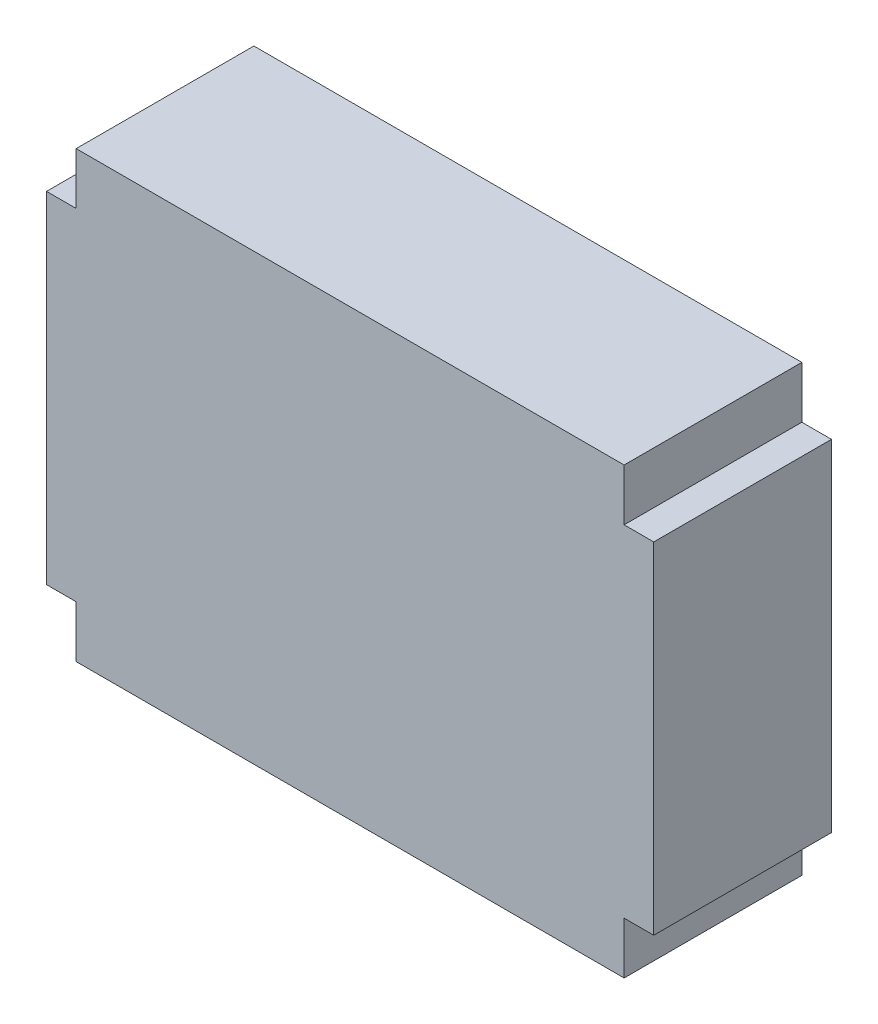
ISO-10303-21;
HEADER;
FILE_DESCRIPTION(('STEP AP214'),'2;1');
FILE_NAME('part.step','',(''),(''),'','','');
FILE_SCHEMA(('AUTOMOTIVE_DESIGN { 1 0 10303 214 1 1 1 1 }'));
ENDSEC;
DATA;
#1=APPLICATION_CONTEXT('core data for automotive mechanical design processes');
#2=APPLICATION_PROTOCOL_DEFINITION('international standard','automotive_design',2000,#1);
#3=PRODUCT_CONTEXT('',#1,'mechanical');
#4=PRODUCT('Part','Part','',(#3));
#5=PRODUCT_RELATED_PRODUCT_CATEGORY('part','',(#4));
#6=PRODUCT_DEFINITION_FORMATION('','',#4);
#7=PRODUCT_DEFINITION_CONTEXT('part definition',#1,'design');
#8=PRODUCT_DEFINITION('design','',#6,#7);
#9=PRODUCT_DEFINITION_SHAPE('','',#8);
#10=(LENGTH_UNIT() NAMED_UNIT(*) SI_UNIT(.MILLI.,.METRE.));
#11=(NAMED_UNIT(*) PLANE_ANGLE_UNIT() SI_UNIT($,.RADIAN.));
#12=(NAMED_UNIT(*) SI_UNIT($,.STERADIAN.) SOLID_ANGLE_UNIT());
#13=UNCERTAINTY_MEASURE_WITH_UNIT(LENGTH_MEASURE(1.E-05),#10,'distance_accuracy_value','');
#14=(GEOMETRIC_REPRESENTATION_CONTEXT(3) GLOBAL_UNCERTAINTY_ASSIGNED_CONTEXT((#13)) GLOBAL_UNIT_ASSIGNED_CONTEXT((#10,
#11,#12)) REPRESENTATION_CONTEXT('',''));
#15=CARTESIAN_POINT('',(0.,0.,0.));
#16=DIRECTION('',(0.,0.,1.));
#17=DIRECTION('',(1.,0.,0.));
#18=AXIS2_PLACEMENT_3D('',#15,#16,#17);
#19=CARTESIAN_POINT('',(-1.85,-1.5,1.2));
#20=DIRECTION('',(0.,1.,0.));
#21=DIRECTION('',(0.,0.,1.));
#22=AXIS2_PLACEMENT_3D('',#19,#20,#21);
#23=PLANE('',#22);
#24=DIRECTION('',(1.,0.,0.));
#25=VECTOR('',#24,1.);
#26=CARTESIAN_POINT('',(-1.85,-1.5,0.));
#27=LINE('',#26,#25);
#28=CARTESIAN_POINT('',(-1.85,-1.5,0.));
#29=VERTEX_POINT('',#28);
#30=CARTESIAN_POINT('',(1.85,-1.5,0.));
#31=VERTEX_POINT('',#30);
#32=EDGE_CURVE('E154',#29,#31,#27,.T.);
#33=ORIENTED_EDGE('',*,*,#32,.T.);
#34=DIRECTION('',(0.,0.,-1.));
#35=VECTOR('',#34,1.);
#36=CARTESIAN_POINT('',(1.85,-1.5,1.2));
#37=LINE('',#36,#35);
#38=CARTESIAN_POINT('',(1.85,-1.5,1.2));
#39=VERTEX_POINT('',#38);
#40=EDGE_CURVE('E11',#39,#31,#37,.T.);
#41=ORIENTED_EDGE('',*,*,#40,.F.);
#42=DIRECTION('',(1.,0.,0.));
#43=VECTOR('',#42,1.);
#44=CARTESIAN_POINT('',(-1.85,-1.5,1.2));
#45=LINE('',#44,#43);
#46=CARTESIAN_POINT('',(-1.85,-1.5,1.2));
#47=VERTEX_POINT('',#46);
#48=EDGE_CURVE('E176',#47,#39,#45,.T.);
#49=ORIENTED_EDGE('',*,*,#48,.F.);
#50=DIRECTION('',(0.,0.,-1.));
#51=VECTOR('',#50,1.);
#52=CARTESIAN_POINT('',(-1.85,-1.5,1.2));
#53=LINE('',#52,#51);
#54=EDGE_CURVE('E150',#47,#29,#53,.T.);
#55=ORIENTED_EDGE('',*,*,#54,.T.);
#56=EDGE_LOOP('',(#33,#41,#49,#55));
#57=FACE_BOUND('',#56,.T.);
#58=ADVANCED_FACE('F34',(#57),#23,.F.);
#59=CARTESIAN_POINT('',(1.85,-1.5,1.2));
#60=DIRECTION('',(-1.,0.,0.));
#61=DIRECTION('',(0.,0.,1.));
#62=AXIS2_PLACEMENT_3D('',#59,#60,#61);
#63=PLANE('',#62);
#64=DIRECTION('',(0.,1.,0.));
#65=VECTOR('',#64,1.);
#66=CARTESIAN_POINT('',(1.85,-1.5,0.));
#67=LINE('',#66,#65);
#68=CARTESIAN_POINT('',(1.85,-1.15,0.));
#69=VERTEX_POINT('',#68);
#70=EDGE_CURVE('E157',#31,#69,#67,.T.);
#71=ORIENTED_EDGE('',*,*,#70,.T.);
#72=DIRECTION('',(0.,0.,-1.));
#73=VECTOR('',#72,1.);
#74=CARTESIAN_POINT('',(1.85,-1.15,1.2));
#75=LINE('',#74,#73);
#76=CARTESIAN_POINT('',(1.85,-1.15,1.2));
#77=VERTEX_POINT('',#76);
#78=EDGE_CURVE('E42',#77,#69,#75,.T.);
#79=ORIENTED_EDGE('',*,*,#78,.F.);
#80=DIRECTION('',(0.,1.,0.));
#81=VECTOR('',#80,1.);
#82=CARTESIAN_POINT('',(1.85,-1.5,1.2));
#83=LINE('',#82,#81);
#84=EDGE_CURVE('E105',#39,#77,#83,.T.);
#85=ORIENTED_EDGE('',*,*,#84,.F.);
#86=ORIENTED_EDGE('',*,*,#40,.T.);
#87=EDGE_LOOP('',(#71,#79,#85,#86));
#88=FACE_BOUND('',#87,.T.);
#89=ADVANCED_FACE('F254',(#88),#63,.F.);
#90=CARTESIAN_POINT('',(1.85,-1.15,1.2));
#91=DIRECTION('',(0.,1.,0.));
#92=DIRECTION('',(0.,0.,1.));
#93=AXIS2_PLACEMENT_3D('',#90,#91,#92);
#94=PLANE('',#93);
#95=DIRECTION('',(1.,0.,0.));
#96=VECTOR('',#95,1.);
#97=CARTESIAN_POINT('',(1.85,-1.15,0.));
#98=LINE('',#97,#96);
#99=CARTESIAN_POINT('',(2.05,-1.15,0.));
#100=VERTEX_POINT('',#99);
#101=EDGE_CURVE('E159',#69,#100,#98,.T.);
#102=ORIENTED_EDGE('',*,*,#101,.T.);
#103=DIRECTION('',(0.,0.,-1.));
#104=VECTOR('',#103,1.);
#105=CARTESIAN_POINT('',(2.05,-1.15,1.2));
#106=LINE('',#105,#104);
#107=CARTESIAN_POINT('',(2.05,-1.15,1.2));
#108=VERTEX_POINT('',#107);
#109=EDGE_CURVE('E195',#108,#100,#106,.T.);
#110=ORIENTED_EDGE('',*,*,#109,.F.);
#111=DIRECTION('',(1.,0.,0.));
#112=VECTOR('',#111,1.);
#113=CARTESIAN_POINT('',(1.85,-1.15,1.2));
#114=LINE('',#113,#112);
#115=EDGE_CURVE('E203',#77,#108,#114,.T.);
#116=ORIENTED_EDGE('',*,*,#115,.F.);
#117=ORIENTED_EDGE('',*,*,#78,.T.);
#118=EDGE_LOOP('',(#102,#110,#116,#117));
#119=FACE_BOUND('',#118,.T.);
#120=ADVANCED_FACE('F201',(#119),#94,.F.);
#121=CARTESIAN_POINT('',(2.05,-1.15,1.2));
#122=DIRECTION('',(-1.,0.,0.));
#123=DIRECTION('',(0.,0.,1.));
#124=AXIS2_PLACEMENT_3D('',#121,#122,#123);
#125=PLANE('',#124);
#126=DIRECTION('',(0.,1.,0.));
#127=VECTOR('',#126,1.);
#128=CARTESIAN_POINT('',(2.05,-1.15,0.));
#129=LINE('',#128,#127);
#130=CARTESIAN_POINT('',(2.05,1.15,0.));
#131=VERTEX_POINT('',#130);
#132=EDGE_CURVE('E161',#100,#131,#129,.T.);
#133=ORIENTED_EDGE('',*,*,#132,.T.);
#134=DIRECTION('',(0.,0.,-1.));
#135=VECTOR('',#134,1.);
#136=CARTESIAN_POINT('',(2.05,1.15,1.2));
#137=LINE('',#136,#135);
#138=CARTESIAN_POINT('',(2.05,1.15,1.2));
#139=VERTEX_POINT('',#138);
#140=EDGE_CURVE('E192',#139,#131,#137,.T.);
#141=ORIENTED_EDGE('',*,*,#140,.F.);
#142=DIRECTION('',(0.,1.,0.));
#143=VECTOR('',#142,1.);
#144=CARTESIAN_POINT('',(2.05,-1.15,1.2));
#145=LINE('',#144,#143);
#146=EDGE_CURVE('E221',#108,#139,#145,.T.);
#147=ORIENTED_EDGE('',*,*,#146,.F.);
#148=ORIENTED_EDGE('',*,*,#109,.T.);
#149=EDGE_LOOP('',(#133,#141,#147,#148));
#150=FACE_BOUND('',#149,.T.);
#151=ADVANCED_FACE('F212',(#150),#125,.F.);
#152=CARTESIAN_POINT('',(2.05,1.15,1.2));
#153=DIRECTION('',(0.,-1.,0.));
#154=DIRECTION('',(0.,0.,-1.));
#155=AXIS2_PLACEMENT_3D('',#152,#153,#154);
#156=PLANE('',#155);
#157=DIRECTION('',(-1.,0.,0.));
#158=VECTOR('',#157,1.);
#159=CARTESIAN_POINT('',(2.05,1.15,0.));
#160=LINE('',#159,#158);
#161=CARTESIAN_POINT('',(1.85,1.15,0.));
#162=VERTEX_POINT('',#161);
#163=EDGE_CURVE('E163',#131,#162,#160,.T.);
#164=ORIENTED_EDGE('',*,*,#163,.T.);
#165=DIRECTION('',(0.,0.,-1.));
#166=VECTOR('',#165,1.);
#167=CARTESIAN_POINT('',(1.85,1.15,1.2));
#168=LINE('',#167,#166);
#169=CARTESIAN_POINT('',(1.85,1.15,1.2));
#170=VERTEX_POINT('',#169);
#171=EDGE_CURVE('E189',#170,#162,#168,.T.);
#172=ORIENTED_EDGE('',*,*,#171,.F.);
#173=DIRECTION('',(-1.,0.,0.));
#174=VECTOR('',#173,1.);
#175=CARTESIAN_POINT('',(2.05,1.15,1.2));
#176=LINE('',#175,#174);
#177=EDGE_CURVE('E218',#139,#170,#176,.T.);
#178=ORIENTED_EDGE('',*,*,#177,.F.);
#179=ORIENTED_EDGE('',*,*,#140,.T.);
#180=EDGE_LOOP('',(#164,#172,#178,#179));
#181=FACE_BOUND('',#180,.T.);
#182=ADVANCED_FACE('F216',(#181),#156,.F.);
#183=CARTESIAN_POINT('',(1.85,1.15,1.2));
#184=DIRECTION('',(-1.,0.,0.));
#185=DIRECTION('',(0.,0.,1.));
#186=AXIS2_PLACEMENT_3D('',#183,#184,#185);
#187=PLANE('',#186);
#188=DIRECTION('',(0.,1.,0.));
#189=VECTOR('',#188,1.);
#190=CARTESIAN_POINT('',(1.85,1.15,0.));
#191=LINE('',#190,#189);
#192=CARTESIAN_POINT('',(1.85,1.5,0.));
#193=VERTEX_POINT('',#192);
#194=EDGE_CURVE('E165',#162,#193,#191,.T.);
#195=ORIENTED_EDGE('',*,*,#194,.T.);
#196=DIRECTION('',(0.,0.,-1.));
#197=VECTOR('',#196,1.);
#198=CARTESIAN_POINT('',(1.85,1.5,1.2));
#199=LINE('',#198,#197);
#200=CARTESIAN_POINT('',(1.85,1.5,1.2));
#201=VERTEX_POINT('',#200);
#202=EDGE_CURVE('E186',#201,#193,#199,.T.);
#203=ORIENTED_EDGE('',*,*,#202,.F.);
#204=DIRECTION('',(0.,1.,0.));
#205=VECTOR('',#204,1.);
#206=CARTESIAN_POINT('',(1.85,1.15,1.2));
#207=LINE('',#206,#205);
#208=EDGE_CURVE('E220',#170,#201,#207,.T.);
#209=ORIENTED_EDGE('',*,*,#208,.F.);
#210=ORIENTED_EDGE('',*,*,#171,.T.);
#211=EDGE_LOOP('',(#195,#203,#209,#210));
#212=FACE_BOUND('',#211,.T.);
#213=ADVANCED_FACE('F267',(#212),#187,.F.);
#214=CARTESIAN_POINT('',(1.85,1.5,1.2));
#215=DIRECTION('',(0.,-1.,0.));
#216=DIRECTION('',(0.,0.,-1.));
#217=AXIS2_PLACEMENT_3D('',#214,#215,#216);
#218=PLANE('',#217);
#219=DIRECTION('',(-1.,0.,0.));
#220=VECTOR('',#219,1.);
#221=CARTESIAN_POINT('',(1.85,1.5,0.));
#222=LINE('',#221,#220);
#223=CARTESIAN_POINT('',(-1.85,1.5,0.));
#224=VERTEX_POINT('',#223);
#225=EDGE_CURVE('E167',#193,#224,#222,.T.);
#226=ORIENTED_EDGE('',*,*,#225,.T.);
#227=DIRECTION('',(0.,0.,-1.));
#228=VECTOR('',#227,1.);
#229=CARTESIAN_POINT('',(-1.85,1.5,1.2));
#230=LINE('',#229,#228);
#231=CARTESIAN_POINT('',(-1.85,1.5,1.2));
#232=VERTEX_POINT('',#231);
#233=EDGE_CURVE('E183',#232,#224,#230,.T.);
#234=ORIENTED_EDGE('',*,*,#233,.F.);
#235=DIRECTION('',(-1.,0.,0.));
#236=VECTOR('',#235,1.);
#237=CARTESIAN_POINT('',(1.85,1.5,1.2));
#238=LINE('',#237,#236);
#239=EDGE_CURVE('E223',#201,#232,#238,.T.);
#240=ORIENTED_EDGE('',*,*,#239,.F.);
#241=ORIENTED_EDGE('',*,*,#202,.T.);
#242=EDGE_LOOP('',(#226,#234,#240,#241));
#243=FACE_BOUND('',#242,.T.);
#244=ADVANCED_FACE('F270',(#243),#218,.F.);
#245=CARTESIAN_POINT('',(-1.85,1.5,1.2));
#246=DIRECTION('',(1.,0.,0.));
#247=DIRECTION('',(0.,0.,-1.));
#248=AXIS2_PLACEMENT_3D('',#245,#246,#247);
#249=PLANE('',#248);
#250=DIRECTION('',(0.,-1.,0.));
#251=VECTOR('',#250,1.);
#252=CARTESIAN_POINT('',(-1.85,1.5,0.));
#253=LINE('',#252,#251);
#254=CARTESIAN_POINT('',(-1.85,1.15,0.));
#255=VERTEX_POINT('',#254);
#256=EDGE_CURVE('E169',#224,#255,#253,.T.);
#257=ORIENTED_EDGE('',*,*,#256,.T.);
#258=DIRECTION('',(0.,0.,-1.));
#259=VECTOR('',#258,1.);
#260=CARTESIAN_POINT('',(-1.85,1.15,1.2));
#261=LINE('',#260,#259);
#262=CARTESIAN_POINT('',(-1.85,1.15,1.2));
#263=VERTEX_POINT('',#262);
#264=EDGE_CURVE('E180',#263,#255,#261,.T.);
#265=ORIENTED_EDGE('',*,*,#264,.F.);
#266=DIRECTION('',(0.,-1.,0.));
#267=VECTOR('',#266,1.);
#268=CARTESIAN_POINT('',(-1.85,1.5,1.2));
#269=LINE('',#268,#267);
#270=EDGE_CURVE('E229',#232,#263,#269,.T.);
#271=ORIENTED_EDGE('',*,*,#270,.F.);
#272=ORIENTED_EDGE('',*,*,#233,.T.);
#273=EDGE_LOOP('',(#257,#265,#271,#272));
#274=FACE_BOUND('',#273,.T.);
#275=ADVANCED_FACE('F235',(#274),#249,.F.);
#276=CARTESIAN_POINT('',(-1.85,1.15,1.2));
#277=DIRECTION('',(0.,-1.,0.));
#278=DIRECTION('',(0.,0.,-1.));
#279=AXIS2_PLACEMENT_3D('',#276,#277,#278);
#280=PLANE('',#279);
#281=DIRECTION('',(-1.,0.,0.));
#282=VECTOR('',#281,1.);
#283=CARTESIAN_POINT('',(-1.85,1.15,0.));
#284=LINE('',#283,#282);
#285=CARTESIAN_POINT('',(-2.05,1.15,0.));
#286=VERTEX_POINT('',#285);
#287=EDGE_CURVE('E171',#255,#286,#284,.T.);
#288=ORIENTED_EDGE('',*,*,#287,.T.);
#289=DIRECTION('',(0.,0.,-1.));
#290=VECTOR('',#289,1.);
#291=CARTESIAN_POINT('',(-2.05,1.15,1.2));
#292=LINE('',#291,#290);
#293=CARTESIAN_POINT('',(-2.05,1.15,1.2));
#294=VERTEX_POINT('',#293);
#295=EDGE_CURVE('E145',#294,#286,#292,.T.);
#296=ORIENTED_EDGE('',*,*,#295,.F.);
#297=DIRECTION('',(-1.,0.,0.));
#298=VECTOR('',#297,1.);
#299=CARTESIAN_POINT('',(-1.85,1.15,1.2));
#300=LINE('',#299,#298);
#301=EDGE_CURVE('E136',#263,#294,#300,.T.);
#302=ORIENTED_EDGE('',*,*,#301,.F.);
#303=ORIENTED_EDGE('',*,*,#264,.T.);
#304=EDGE_LOOP('',(#288,#296,#302,#303));
#305=FACE_BOUND('',#304,.T.);
#306=ADVANCED_FACE('F239',(#305),#280,.F.);
#307=CARTESIAN_POINT('',(-2.05,1.15,1.2));
#308=DIRECTION('',(1.,0.,0.));
#309=DIRECTION('',(0.,0.,-1.));
#310=AXIS2_PLACEMENT_3D('',#307,#308,#309);
#311=PLANE('',#310);
#312=DIRECTION('',(0.,-1.,0.));
#313=VECTOR('',#312,1.);
#314=CARTESIAN_POINT('',(-2.05,1.15,0.));
#315=LINE('',#314,#313);
#316=CARTESIAN_POINT('',(-2.05,-1.15,0.));
#317=VERTEX_POINT('',#316);
#318=EDGE_CURVE('E144',#286,#317,#315,.T.);
#319=ORIENTED_EDGE('',*,*,#318,.T.);
#320=DIRECTION('',(0.,0.,-1.));
#321=VECTOR('',#320,1.);
#322=CARTESIAN_POINT('',(-2.05,-1.15,1.2));
#323=LINE('',#322,#321);
#324=CARTESIAN_POINT('',(-2.05,-1.15,1.2));
#325=VERTEX_POINT('',#324);
#326=EDGE_CURVE('E141',#325,#317,#323,.T.);
#327=ORIENTED_EDGE('',*,*,#326,.F.);
#328=DIRECTION('',(0.,-1.,0.));
#329=VECTOR('',#328,1.);
#330=CARTESIAN_POINT('',(-2.05,1.15,1.2));
#331=LINE('',#330,#329);
#332=EDGE_CURVE('E130',#294,#325,#331,.T.);
#333=ORIENTED_EDGE('',*,*,#332,.F.);
#334=ORIENTED_EDGE('',*,*,#295,.T.);
#335=EDGE_LOOP('',(#319,#327,#333,#334));
#336=FACE_BOUND('',#335,.T.);
#337=ADVANCED_FACE('F142',(#336),#311,.F.);
#338=CARTESIAN_POINT('',(-2.05,-1.15,1.2));
#339=DIRECTION('',(0.,1.,0.));
#340=DIRECTION('',(0.,0.,1.));
#341=AXIS2_PLACEMENT_3D('',#338,#339,#340);
#342=PLANE('',#341);
#343=DIRECTION('',(1.,0.,0.));
#344=VECTOR('',#343,1.);
#345=CARTESIAN_POINT('',(-2.05,-1.15,0.));
#346=LINE('',#345,#344);
#347=CARTESIAN_POINT('',(-1.85,-1.15,0.));
#348=VERTEX_POINT('',#347);
#349=EDGE_CURVE('E91',#317,#348,#346,.T.);
#350=ORIENTED_EDGE('',*,*,#349,.T.);
#351=DIRECTION('',(0.,0.,-1.));
#352=VECTOR('',#351,1.);
#353=CARTESIAN_POINT('',(-1.85,-1.15,1.2));
#354=LINE('',#353,#352);
#355=CARTESIAN_POINT('',(-1.85,-1.15,1.2));
#356=VERTEX_POINT('',#355);
#357=EDGE_CURVE('E146',#356,#348,#354,.T.);
#358=ORIENTED_EDGE('',*,*,#357,.F.);
#359=DIRECTION('',(1.,0.,0.));
#360=VECTOR('',#359,1.);
#361=CARTESIAN_POINT('',(-2.05,-1.15,1.2));
#362=LINE('',#361,#360);
#363=EDGE_CURVE('E134',#325,#356,#362,.T.);
#364=ORIENTED_EDGE('',*,*,#363,.F.);
#365=ORIENTED_EDGE('',*,*,#326,.T.);
#366=EDGE_LOOP('',(#350,#358,#364,#365));
#367=FACE_BOUND('',#366,.T.);
#368=ADVANCED_FACE('F148',(#367),#342,.F.);
#369=CARTESIAN_POINT('',(-1.85,-1.15,1.2));
#370=DIRECTION('',(1.,0.,0.));
#371=DIRECTION('',(0.,0.,-1.));
#372=AXIS2_PLACEMENT_3D('',#369,#370,#371);
#373=PLANE('',#372);
#374=DIRECTION('',(0.,-1.,0.));
#375=VECTOR('',#374,1.);
#376=CARTESIAN_POINT('',(-1.85,-1.15,0.));
#377=LINE('',#376,#375);
#378=EDGE_CURVE('E97',#348,#29,#377,.T.);
#379=ORIENTED_EDGE('',*,*,#378,.T.);
#380=ORIENTED_EDGE('',*,*,#54,.F.);
#381=DIRECTION('',(0.,-1.,0.));
#382=VECTOR('',#381,1.);
#383=CARTESIAN_POINT('',(-1.85,-1.15,1.2));
#384=LINE('',#383,#382);
#385=EDGE_CURVE('E50',#356,#47,#384,.T.);
#386=ORIENTED_EDGE('',*,*,#385,.F.);
#387=ORIENTED_EDGE('',*,*,#357,.T.);
#388=EDGE_LOOP('',(#379,#380,#386,#387));
#389=FACE_BOUND('',#388,.T.);
#390=ADVANCED_FACE('F243',(#389),#373,.F.);
#391=CARTESIAN_POINT('',(0.,0.,1.2));
#392=DIRECTION('',(0.,0.,1.));
#393=DIRECTION('',(1.,0.,0.));
#394=AXIS2_PLACEMENT_3D('',#391,#392,#393);
#395=PLANE('',#394);
#396=ORIENTED_EDGE('',*,*,#48,.T.);
#397=ORIENTED_EDGE('',*,*,#84,.T.);
#398=ORIENTED_EDGE('',*,*,#115,.T.);
#399=ORIENTED_EDGE('',*,*,#146,.T.);
#400=ORIENTED_EDGE('',*,*,#177,.T.);
#401=ORIENTED_EDGE('',*,*,#208,.T.);
#402=ORIENTED_EDGE('',*,*,#239,.T.);
#403=ORIENTED_EDGE('',*,*,#270,.T.);
#404=ORIENTED_EDGE('',*,*,#301,.T.);
#405=ORIENTED_EDGE('',*,*,#332,.T.);
#406=ORIENTED_EDGE('',*,*,#363,.T.);
#407=ORIENTED_EDGE('',*,*,#385,.T.);
#408=EDGE_LOOP('',(#396,#397,#398,#399,#400,#401,#402,#403,#404,#405,#406,#407));
#409=FACE_BOUND('',#408,.T.);
#410=ADVANCED_FACE('F132',(#409),#395,.T.);
#411=CARTESIAN_POINT('',(0.,0.,0.));
#412=DIRECTION('',(0.,0.,1.));
#413=DIRECTION('',(1.,0.,0.));
#414=AXIS2_PLACEMENT_3D('',#411,#412,#413);
#415=PLANE('',#414);
#416=ORIENTED_EDGE('',*,*,#32,.F.);
#417=ORIENTED_EDGE('',*,*,#378,.F.);
#418=ORIENTED_EDGE('',*,*,#349,.F.);
#419=ORIENTED_EDGE('',*,*,#318,.F.);
#420=ORIENTED_EDGE('',*,*,#287,.F.);
#421=ORIENTED_EDGE('',*,*,#256,.F.);
#422=ORIENTED_EDGE('',*,*,#225,.F.);
#423=ORIENTED_EDGE('',*,*,#194,.F.);
#424=ORIENTED_EDGE('',*,*,#163,.F.);
#425=ORIENTED_EDGE('',*,*,#132,.F.);
#426=ORIENTED_EDGE('',*,*,#101,.F.);
#427=ORIENTED_EDGE('',*,*,#70,.F.);
#428=EDGE_LOOP('',(#416,#417,#418,#419,#420,#421,#422,#423,#424,#425,#426,#427));
#429=FACE_BOUND('',#428,.T.);
#430=ADVANCED_FACE('F207',(#429),#415,.F.);
#431=CLOSED_SHELL('',(#58,#89,#120,#151,#182,#213,#244,#275,#306,#337,#368,#390,#410,#430));
#432=MANIFOLD_SOLID_BREP('B2',#431);
#433=ADVANCED_BREP_SHAPE_REPRESENTATION('',(#18,#432),#14);
#434=SHAPE_DEFINITION_REPRESENTATION(#9,#433);
ENDSEC;
END-ISO-10303-21;
